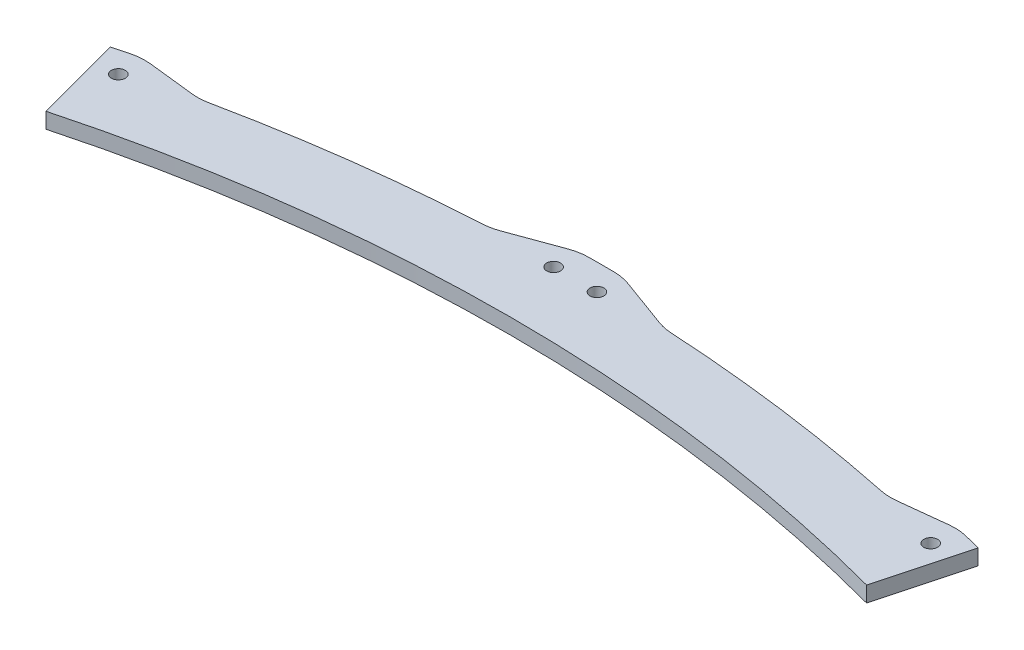
ISO-10303-21;
HEADER;
FILE_DESCRIPTION(('STEP AP214'),'2;1');
FILE_NAME('part.step','',(''),(''),'','','');
FILE_SCHEMA(('AUTOMOTIVE_DESIGN { 1 0 10303 214 1 1 1 1 }'));
ENDSEC;
DATA;
#1=APPLICATION_CONTEXT('core data for automotive mechanical design processes');
#2=APPLICATION_PROTOCOL_DEFINITION('international standard','automotive_design',2000,#1);
#3=PRODUCT_CONTEXT('',#1,'mechanical');
#4=PRODUCT('Part','Part','',(#3));
#5=PRODUCT_RELATED_PRODUCT_CATEGORY('part','',(#4));
#6=PRODUCT_DEFINITION_FORMATION('','',#4);
#7=PRODUCT_DEFINITION_CONTEXT('part definition',#1,'design');
#8=PRODUCT_DEFINITION('design','',#6,#7);
#9=PRODUCT_DEFINITION_SHAPE('','',#8);
#10=(LENGTH_UNIT() NAMED_UNIT(*) SI_UNIT(.MILLI.,.METRE.));
#11=(NAMED_UNIT(*) PLANE_ANGLE_UNIT() SI_UNIT($,.RADIAN.));
#12=(NAMED_UNIT(*) SI_UNIT($,.STERADIAN.) SOLID_ANGLE_UNIT());
#13=UNCERTAINTY_MEASURE_WITH_UNIT(LENGTH_MEASURE(1.E-05),#10,'distance_accuracy_value','');
#14=(GEOMETRIC_REPRESENTATION_CONTEXT(3) GLOBAL_UNCERTAINTY_ASSIGNED_CONTEXT((#13)) GLOBAL_UNIT_ASSIGNED_CONTEXT((#10,
#11,#12)) REPRESENTATION_CONTEXT('',''));
#15=CARTESIAN_POINT('',(0.,0.,0.));
#16=DIRECTION('',(0.,0.,1.));
#17=DIRECTION('',(1.,0.,0.));
#18=AXIS2_PLACEMENT_3D('',#15,#16,#17);
#19=CARTESIAN_POINT('',(0.,9.00000000000001,0.));
#20=DIRECTION('',(-0.96592582628907,0.,-0.258819045102515));
#21=DIRECTION('',(-0.258819045102515,0.,0.96592582628907));
#22=AXIS2_PLACEMENT_3D('',#19,#20,#21);
#23=PLANE('',#22);
#24=DIRECTION('',(0.258819045102515,0.,-0.96592582628907));
#25=VECTOR('',#24,1.);
#26=CARTESIAN_POINT('',(0.,0.,0.));
#27=LINE('',#26,#25);
#28=CARTESIAN_POINT('',(236.819426268801,0.,-883.822131054499));
#29=VERTEX_POINT('',#28);
#30=CARTESIAN_POINT('',(250.407426136683,0.,-934.533236934675));
#31=VERTEX_POINT('',#30);
#32=EDGE_CURVE('E211',#29,#31,#27,.T.);
#33=ORIENTED_EDGE('',*,*,#32,.T.);
#34=DIRECTION('',(0.,-1.,0.));
#35=VECTOR('',#34,1.);
#36=CARTESIAN_POINT('',(250.407426136683,9.00000000000001,-934.533236934675));
#37=LINE('',#36,#35);
#38=CARTESIAN_POINT('',(250.407426136683,9.00000000000001,-934.533236934675));
#39=VERTEX_POINT('',#38);
#40=EDGE_CURVE('E191',#39,#31,#37,.T.);
#41=ORIENTED_EDGE('',*,*,#40,.F.);
#42=DIRECTION('',(0.258819045102515,0.,-0.96592582628907));
#43=VECTOR('',#42,1.);
#44=CARTESIAN_POINT('',(0.,9.00000000000001,0.));
#45=LINE('',#44,#43);
#46=CARTESIAN_POINT('',(236.819426268801,9.00000000000001,-883.822131054499));
#47=VERTEX_POINT('',#46);
#48=EDGE_CURVE('E198',#47,#39,#45,.T.);
#49=ORIENTED_EDGE('',*,*,#48,.F.);
#50=DIRECTION('',(0.,-1.,0.));
#51=VECTOR('',#50,1.);
#52=CARTESIAN_POINT('',(236.819426268801,9.00000000000001,-883.822131054499));
#53=LINE('',#52,#51);
#54=EDGE_CURVE('E363',#47,#29,#53,.T.);
#55=ORIENTED_EDGE('',*,*,#54,.T.);
#56=EDGE_LOOP('',(#33,#41,#49,#55));
#57=FACE_BOUND('',#56,.T.);
#58=ADVANCED_FACE('F48',(#57),#23,.F.);
#59=CARTESIAN_POINT('',(0.,9.00000000000001,0.));
#60=DIRECTION('',(0.,-1.,0.));
#61=DIRECTION('',(0.,0.,-1.));
#62=AXIS2_PLACEMENT_3D('',#59,#60,#61);
#63=CYLINDRICAL_SURFACE('',#62,967.5);
#64=CARTESIAN_POINT('',(0.,0.,0.));
#65=DIRECTION('',(0.,1.,0.));
#66=DIRECTION('',(0.,0.,1.));
#67=AXIS2_PLACEMENT_3D('',#64,#65,#66);
#68=CIRCLE('',#67,967.5);
#69=CARTESIAN_POINT('',(241.267136964022,0.,-936.934586095093));
#70=VERTEX_POINT('',#69);
#71=EDGE_CURVE('E382',#31,#70,#68,.T.);
#72=ORIENTED_EDGE('',*,*,#71,.T.);
#73=DIRECTION('',(0.,-1.,0.));
#74=VECTOR('',#73,1.);
#75=CARTESIAN_POINT('',(241.267136964022,9.00000000000001,-936.934586095093));
#76=LINE('',#75,#74);
#77=CARTESIAN_POINT('',(241.267136964022,9.00000000000001,-936.934586095093));
#78=VERTEX_POINT('',#77);
#79=EDGE_CURVE('E194',#70,#78,#76,.F.);
#80=ORIENTED_EDGE('',*,*,#79,.T.);
#81=CARTESIAN_POINT('',(0.,9.00000000000001,0.));
#82=DIRECTION('',(0.,1.,0.));
#83=DIRECTION('',(0.,0.,1.));
#84=AXIS2_PLACEMENT_3D('',#81,#82,#83);
#85=CIRCLE('',#84,967.5);
#86=EDGE_CURVE('E186',#39,#78,#85,.T.);
#87=ORIENTED_EDGE('',*,*,#86,.F.);
#88=ORIENTED_EDGE('',*,*,#40,.T.);
#89=EDGE_LOOP('',(#72,#80,#87,#88));
#90=FACE_BOUND('',#89,.T.);
#91=ADVANCED_FACE('F189',(#90),#63,.T.);
#92=CARTESIAN_POINT('',(-100.520614540542,9.00000000000001,-900.76158334821));
#93=DIRECTION('',(0.110906689405892,0.,0.99383082375474));
#94=DIRECTION('',(0.99383082375474,0.,-0.110906689405892));
#95=AXIS2_PLACEMENT_3D('',#92,#93,#94);
#96=PLANE('',#95);
#97=DIRECTION('',(-0.99383082375474,0.,0.110906689405892));
#98=VECTOR('',#97,1.);
#99=CARTESIAN_POINT('',(-100.520614540542,9.00000000000001,-900.76158334821));
#100=LINE('',#99,#98);
#101=CARTESIAN_POINT('',(230.458784748077,9.00000000000001,-937.69727557998));
#102=VERTEX_POINT('',#101);
#103=CARTESIAN_POINT('',(203.318668859168,9.00000000000001,-934.668570561596));
#104=VERTEX_POINT('',#103);
#105=EDGE_CURVE('E197',#102,#104,#100,.T.);
#106=ORIENTED_EDGE('',*,*,#105,.F.);
#107=DIRECTION('',(0.,-1.,0.));
#108=VECTOR('',#107,1.);
#109=CARTESIAN_POINT('',(230.458784748077,9.00000000000001,-937.69727557998));
#110=LINE('',#109,#108);
#111=CARTESIAN_POINT('',(230.458784748077,0.,-937.69727557998));
#112=VERTEX_POINT('',#111);
#113=EDGE_CURVE('E219',#102,#112,#110,.T.);
#114=ORIENTED_EDGE('',*,*,#113,.T.);
#115=DIRECTION('',(-0.99383082375474,0.,0.110906689405892));
#116=VECTOR('',#115,1.);
#117=CARTESIAN_POINT('',(-100.520614540542,0.,-900.76158334821));
#118=LINE('',#117,#116);
#119=CARTESIAN_POINT('',(203.318668859168,0.,-934.668570561596));
#120=VERTEX_POINT('',#119);
#121=EDGE_CURVE('E385',#112,#120,#118,.T.);
#122=ORIENTED_EDGE('',*,*,#121,.T.);
#123=DIRECTION('',(0.,1.,0.));
#124=VECTOR('',#123,1.);
#125=CARTESIAN_POINT('',(203.318668859168,9.00000000000001,-934.668570561596));
#126=LINE('',#125,#124);
#127=EDGE_CURVE('E213',#120,#104,#126,.T.);
#128=ORIENTED_EDGE('',*,*,#127,.T.);
#129=EDGE_LOOP('',(#106,#114,#122,#128));
#130=FACE_BOUND('',#129,.T.);
#131=ADVANCED_FACE('F434',(#130),#96,.F.);
#132=CARTESIAN_POINT('',(0.,9.00000000000001,0.));
#133=DIRECTION('',(0.,-1.,0.));
#134=DIRECTION('',(0.,0.,-1.));
#135=AXIS2_PLACEMENT_3D('',#132,#133,#134);
#136=CYLINDRICAL_SURFACE('',#135,955.);
#137=CARTESIAN_POINT('',(0.,9.00000000000001,0.));
#138=DIRECTION('',(0.,1.,0.));
#139=DIRECTION('',(0.,0.,1.));
#140=AXIS2_PLACEMENT_3D('',#137,#138,#139);
#141=CIRCLE('',#140,955.);
#142=CARTESIAN_POINT('',(193.900357471093,9.00000000000001,-935.108363438474));
#143=VERTEX_POINT('',#142);
#144=CARTESIAN_POINT('',(54.4011990905174,9.00000000000001,-953.449269514385));
#145=VERTEX_POINT('',#144);
#146=EDGE_CURVE('E354',#143,#145,#141,.T.);
#147=ORIENTED_EDGE('',*,*,#146,.F.);
#148=DIRECTION('',(0.,-1.,0.));
#149=VECTOR('',#148,1.);
#150=CARTESIAN_POINT('',(193.900357471093,9.00000000000001,-935.108363438475));
#151=LINE('',#150,#149);
#152=CARTESIAN_POINT('',(193.900357471093,0.,-935.108363438474));
#153=VERTEX_POINT('',#152);
#154=EDGE_CURVE('E256',#143,#153,#151,.T.);
#155=ORIENTED_EDGE('',*,*,#154,.T.);
#156=CARTESIAN_POINT('',(0.,0.,0.));
#157=DIRECTION('',(0.,1.,0.));
#158=DIRECTION('',(0.,0.,1.));
#159=AXIS2_PLACEMENT_3D('',#156,#157,#158);
#160=CIRCLE('',#159,955.);
#161=CARTESIAN_POINT('',(54.4011990905174,0.,-953.449269514385));
#162=VERTEX_POINT('',#161);
#163=EDGE_CURVE('E337',#153,#162,#160,.T.);
#164=ORIENTED_EDGE('',*,*,#163,.T.);
#165=DIRECTION('',(0.,-1.,0.));
#166=VECTOR('',#165,1.);
#167=CARTESIAN_POINT('',(54.4011990905174,9.00000000000001,-953.449269514385));
#168=LINE('',#167,#166);
#169=EDGE_CURVE('E253',#162,#145,#168,.F.);
#170=ORIENTED_EDGE('',*,*,#169,.T.);
#171=EDGE_LOOP('',(#147,#155,#164,#170));
#172=FACE_BOUND('',#171,.T.);
#173=ADVANCED_FACE('F486',(#172),#136,.T.);
#174=CARTESIAN_POINT('',(313.79566180747,9.00000000000001,-857.112527219899));
#175=DIRECTION('',(0.343792078237133,0.,-0.939045795976635));
#176=DIRECTION('',(-0.939045795976636,0.,-0.343792078237133));
#177=AXIS2_PLACEMENT_3D('',#174,#175,#176);
#178=PLANE('',#177);
#179=DIRECTION('',(0.939045795976636,0.,0.343792078237133));
#180=VECTOR('',#179,1.);
#181=CARTESIAN_POINT('',(313.79566180747,9.00000000000001,-857.112527219899));
#182=LINE('',#181,#180);
#183=CARTESIAN_POINT('',(17.3462496087965,9.00000000000001,-965.64499704046));
#184=VERTEX_POINT('',#183);
#185=CARTESIAN_POINT('',(45.7963749347286,9.00000000000001,-955.229181588417));
#186=VERTEX_POINT('',#185);
#187=EDGE_CURVE('E441',#184,#186,#182,.T.);
#188=ORIENTED_EDGE('',*,*,#187,.T.);
#189=DIRECTION('',(0.,-1.,0.));
#190=VECTOR('',#189,1.);
#191=CARTESIAN_POINT('',(45.7963749347286,9.00000000000001,-955.229181588417));
#192=LINE('',#191,#190);
#193=CARTESIAN_POINT('',(45.7963749347286,0.,-955.229181588417));
#194=VERTEX_POINT('',#193);
#195=EDGE_CURVE('E263',#186,#194,#192,.T.);
#196=ORIENTED_EDGE('',*,*,#195,.T.);
#197=DIRECTION('',(0.939045795976636,0.,0.343792078237133));
#198=VECTOR('',#197,1.);
#199=CARTESIAN_POINT('',(313.79566180747,0.,-857.112527219899));
#200=LINE('',#199,#198);
#201=CARTESIAN_POINT('',(17.3462496087965,0.,-965.64499704046));
#202=VERTEX_POINT('',#201);
#203=EDGE_CURVE('E391',#202,#194,#200,.T.);
#204=ORIENTED_EDGE('',*,*,#203,.F.);
#205=DIRECTION('',(0.,-1.,0.));
#206=VECTOR('',#205,1.);
#207=CARTESIAN_POINT('',(17.3462496087965,9.00000000000001,-965.64499704046));
#208=LINE('',#207,#206);
#209=EDGE_CURVE('E260',#202,#184,#208,.F.);
#210=ORIENTED_EDGE('',*,*,#209,.T.);
#211=EDGE_LOOP('',(#188,#196,#204,#210));
#212=FACE_BOUND('',#211,.T.);
#213=ADVANCED_FACE('F476',(#212),#178,.T.);
#214=CARTESIAN_POINT('',(0.,9.00000000000001,0.));
#215=DIRECTION('',(0.,-1.,0.));
#216=DIRECTION('',(0.,0.,-1.));
#217=AXIS2_PLACEMENT_3D('',#214,#215,#216);
#218=CYLINDRICAL_SURFACE('',#217,967.5);
#219=CARTESIAN_POINT('',(0.,9.00000000000001,0.));
#220=DIRECTION('',(0.,1.,0.));
#221=DIRECTION('',(0.,0.,1.));
#222=AXIS2_PLACEMENT_3D('',#219,#220,#221);
#223=CIRCLE('',#222,967.5);
#224=CARTESIAN_POINT('',(-7.25752685405631,9.00000000000001,-967.472779102318));
#225=VERTEX_POINT('',#224);
#226=CARTESIAN_POINT('',(7.25752685405631,9.00000000000001,-967.472779102318));
#227=VERTEX_POINT('',#226);
#228=EDGE_CURVE('E445',#225,#227,#223,.F.);
#229=ORIENTED_EDGE('',*,*,#228,.T.);
#230=DIRECTION('',(0.,-1.,0.));
#231=VECTOR('',#230,1.);
#232=CARTESIAN_POINT('',(7.25752685405634,9.00000000000001,-967.472779102318));
#233=LINE('',#232,#231);
#234=CARTESIAN_POINT('',(7.25752685405631,0.,-967.472779102318));
#235=VERTEX_POINT('',#234);
#236=EDGE_CURVE('E270',#227,#235,#233,.T.);
#237=ORIENTED_EDGE('',*,*,#236,.T.);
#238=CARTESIAN_POINT('',(0.,0.,0.));
#239=DIRECTION('',(0.,1.,0.));
#240=DIRECTION('',(0.,0.,1.));
#241=AXIS2_PLACEMENT_3D('',#238,#239,#240);
#242=CIRCLE('',#241,967.5);
#243=CARTESIAN_POINT('',(-7.25752685405631,0.,-967.472779102318));
#244=VERTEX_POINT('',#243);
#245=EDGE_CURVE('E395',#244,#235,#242,.F.);
#246=ORIENTED_EDGE('',*,*,#245,.F.);
#247=DIRECTION('',(0.,-1.,0.));
#248=VECTOR('',#247,1.);
#249=CARTESIAN_POINT('',(-7.25752685405634,9.00000000000001,-967.472779102318));
#250=LINE('',#249,#248);
#251=EDGE_CURVE('E267',#244,#225,#250,.F.);
#252=ORIENTED_EDGE('',*,*,#251,.T.);
#253=EDGE_LOOP('',(#229,#237,#246,#252));
#254=FACE_BOUND('',#253,.T.);
#255=ADVANCED_FACE('F469',(#254),#218,.T.);
#256=CARTESIAN_POINT('',(-313.79566180747,9.00000000000001,-857.112527219899));
#257=DIRECTION('',(0.343792078237133,0.,0.939045795976635));
#258=DIRECTION('',(0.939045795976636,0.,-0.343792078237133));
#259=AXIS2_PLACEMENT_3D('',#256,#257,#258);
#260=PLANE('',#259);
#261=DIRECTION('',(-0.939045795976636,0.,0.343792078237133));
#262=VECTOR('',#261,1.);
#263=CARTESIAN_POINT('',(-313.79566180747,9.00000000000001,-857.112527219899));
#264=LINE('',#263,#262);
#265=CARTESIAN_POINT('',(-17.3462496087965,9.00000000000001,-965.64499704046));
#266=VERTEX_POINT('',#265);
#267=CARTESIAN_POINT('',(-45.7963749347286,9.00000000000001,-955.229181588417));
#268=VERTEX_POINT('',#267);
#269=EDGE_CURVE('E352',#266,#268,#264,.T.);
#270=ORIENTED_EDGE('',*,*,#269,.F.);
#271=DIRECTION('',(0.,1.,0.));
#272=VECTOR('',#271,1.);
#273=CARTESIAN_POINT('',(-17.3462496087965,0.,-965.64499704046));
#274=LINE('',#273,#272);
#275=CARTESIAN_POINT('',(-17.3462496087965,0.,-965.64499704046));
#276=VERTEX_POINT('',#275);
#277=EDGE_CURVE('E277',#266,#276,#274,.F.);
#278=ORIENTED_EDGE('',*,*,#277,.T.);
#279=DIRECTION('',(-0.939045795976636,0.,0.343792078237133));
#280=VECTOR('',#279,1.);
#281=CARTESIAN_POINT('',(-313.79566180747,0.,-857.112527219899));
#282=LINE('',#281,#280);
#283=CARTESIAN_POINT('',(-45.7963749347286,0.,-955.229181588417));
#284=VERTEX_POINT('',#283);
#285=EDGE_CURVE('E335',#276,#284,#282,.T.);
#286=ORIENTED_EDGE('',*,*,#285,.T.);
#287=DIRECTION('',(0.,1.,0.));
#288=VECTOR('',#287,1.);
#289=CARTESIAN_POINT('',(-45.7963749347286,9.00000000000001,-955.229181588417));
#290=LINE('',#289,#288);
#291=EDGE_CURVE('E274',#284,#268,#290,.T.);
#292=ORIENTED_EDGE('',*,*,#291,.T.);
#293=EDGE_LOOP('',(#270,#278,#286,#292));
#294=FACE_BOUND('',#293,.T.);
#295=ADVANCED_FACE('F464',(#294),#260,.F.);
#296=CARTESIAN_POINT('',(-54.4011990905174,9.00000000000001,-953.449269514385));
#297=VERTEX_POINT('',#296);
#298=CARTESIAN_POINT('',(-193.900357471093,9.00000000000001,-935.108363438474));
#299=VERTEX_POINT('',#298);
#300=EDGE_CURVE('E345',#297,#299,#141,.T.);
#301=ORIENTED_EDGE('',*,*,#300,.F.);
#302=DIRECTION('',(0.,-1.,0.));
#303=VECTOR('',#302,1.);
#304=CARTESIAN_POINT('',(-54.4011990905174,9.00000000000001,-953.449269514385));
#305=LINE('',#304,#303);
#306=CARTESIAN_POINT('',(-54.4011990905174,0.,-953.449269514385));
#307=VERTEX_POINT('',#306);
#308=EDGE_CURVE('E284',#297,#307,#305,.T.);
#309=ORIENTED_EDGE('',*,*,#308,.T.);
#310=CARTESIAN_POINT('',(-193.900357471093,0.,-935.108363438474));
#311=VERTEX_POINT('',#310);
#312=EDGE_CURVE('E324',#307,#311,#160,.T.);
#313=ORIENTED_EDGE('',*,*,#312,.T.);
#314=DIRECTION('',(0.,-1.,0.));
#315=VECTOR('',#314,1.);
#316=CARTESIAN_POINT('',(-193.900357471093,9.00000000000001,-935.108363438475));
#317=LINE('',#316,#315);
#318=EDGE_CURVE('E281',#311,#299,#317,.F.);
#319=ORIENTED_EDGE('',*,*,#318,.T.);
#320=EDGE_LOOP('',(#301,#309,#313,#319));
#321=FACE_BOUND('',#320,.T.);
#322=ADVANCED_FACE('F332',(#321),#136,.T.);
#323=CARTESIAN_POINT('',(100.520614540542,9.00000000000001,-900.76158334821));
#324=DIRECTION('',(0.110906689405892,0.,-0.99383082375474));
#325=DIRECTION('',(-0.99383082375474,0.,-0.110906689405892));
#326=AXIS2_PLACEMENT_3D('',#323,#324,#325);
#327=PLANE('',#326);
#328=DIRECTION('',(0.99383082375474,0.,0.110906689405892));
#329=VECTOR('',#328,1.);
#330=CARTESIAN_POINT('',(100.520614540542,9.00000000000001,-900.76158334821));
#331=LINE('',#330,#329);
#332=CARTESIAN_POINT('',(-230.458784748077,9.00000000000001,-937.69727557998));
#333=VERTEX_POINT('',#332);
#334=CARTESIAN_POINT('',(-203.318668859168,9.00000000000001,-934.668570561596));
#335=VERTEX_POINT('',#334);
#336=EDGE_CURVE('E342',#333,#335,#331,.T.);
#337=ORIENTED_EDGE('',*,*,#336,.T.);
#338=DIRECTION('',(0.,-1.,0.));
#339=VECTOR('',#338,1.);
#340=CARTESIAN_POINT('',(-203.318668859168,9.00000000000001,-934.668570561596));
#341=LINE('',#340,#339);
#342=CARTESIAN_POINT('',(-203.318668859168,0.,-934.668570561596));
#343=VERTEX_POINT('',#342);
#344=EDGE_CURVE('E291',#335,#343,#341,.T.);
#345=ORIENTED_EDGE('',*,*,#344,.T.);
#346=DIRECTION('',(0.99383082375474,0.,0.110906689405892));
#347=VECTOR('',#346,1.);
#348=CARTESIAN_POINT('',(100.520614540542,0.,-900.76158334821));
#349=LINE('',#348,#347);
#350=CARTESIAN_POINT('',(-230.458784748077,0.,-937.69727557998));
#351=VERTEX_POINT('',#350);
#352=EDGE_CURVE('E326',#351,#343,#349,.T.);
#353=ORIENTED_EDGE('',*,*,#352,.F.);
#354=DIRECTION('',(0.,-1.,0.));
#355=VECTOR('',#354,1.);
#356=CARTESIAN_POINT('',(-230.458784748077,9.00000000000001,-937.69727557998));
#357=LINE('',#356,#355);
#358=EDGE_CURVE('E288',#351,#333,#357,.F.);
#359=ORIENTED_EDGE('',*,*,#358,.T.);
#360=EDGE_LOOP('',(#337,#345,#353,#359));
#361=FACE_BOUND('',#360,.T.);
#362=ADVANCED_FACE('F340',(#361),#327,.T.);
#363=CARTESIAN_POINT('',(0.,9.00000000000001,0.));
#364=DIRECTION('',(0.,-1.,0.));
#365=DIRECTION('',(0.,0.,-1.));
#366=AXIS2_PLACEMENT_3D('',#363,#364,#365);
#367=CYLINDRICAL_SURFACE('',#366,967.5);
#368=CARTESIAN_POINT('',(0.,9.00000000000001,0.));
#369=DIRECTION('',(0.,1.,0.));
#370=DIRECTION('',(0.,0.,1.));
#371=AXIS2_PLACEMENT_3D('',#368,#369,#370);
#372=CIRCLE('',#371,967.5);
#373=CARTESIAN_POINT('',(-250.407426136683,9.00000000000001,-934.533236934675));
#374=VERTEX_POINT('',#373);
#375=CARTESIAN_POINT('',(-241.267136964022,9.00000000000001,-936.934586095093));
#376=VERTEX_POINT('',#375);
#377=EDGE_CURVE('E344',#374,#376,#372,.F.);
#378=ORIENTED_EDGE('',*,*,#377,.T.);
#379=DIRECTION('',(0.,-1.,0.));
#380=VECTOR('',#379,1.);
#381=CARTESIAN_POINT('',(-241.267136964022,9.00000000000001,-936.934586095093));
#382=LINE('',#381,#380);
#383=CARTESIAN_POINT('',(-241.267136964022,0.,-936.934586095093));
#384=VERTEX_POINT('',#383);
#385=EDGE_CURVE('E295',#376,#384,#382,.T.);
#386=ORIENTED_EDGE('',*,*,#385,.T.);
#387=CARTESIAN_POINT('',(0.,0.,0.));
#388=DIRECTION('',(0.,1.,0.));
#389=DIRECTION('',(0.,0.,1.));
#390=AXIS2_PLACEMENT_3D('',#387,#388,#389);
#391=CIRCLE('',#390,967.5);
#392=CARTESIAN_POINT('',(-250.407426136683,0.,-934.533236934675));
#393=VERTEX_POINT('',#392);
#394=EDGE_CURVE('E404',#393,#384,#391,.F.);
#395=ORIENTED_EDGE('',*,*,#394,.F.);
#396=DIRECTION('',(0.,-1.,0.));
#397=VECTOR('',#396,1.);
#398=CARTESIAN_POINT('',(-250.407426136683,9.00000000000001,-934.533236934675));
#399=LINE('',#398,#397);
#400=EDGE_CURVE('E214',#374,#393,#399,.T.);
#401=ORIENTED_EDGE('',*,*,#400,.F.);
#402=EDGE_LOOP('',(#378,#386,#395,#401));
#403=FACE_BOUND('',#402,.T.);
#404=ADVANCED_FACE('F549',(#403),#367,.T.);
#405=CARTESIAN_POINT('',(0.,9.00000000000001,0.));
#406=DIRECTION('',(-0.96592582628907,0.,0.258819045102515));
#407=DIRECTION('',(0.258819045102515,0.,0.96592582628907));
#408=AXIS2_PLACEMENT_3D('',#405,#406,#407);
#409=PLANE('',#408);
#410=DIRECTION('',(-0.258819045102515,0.,-0.96592582628907));
#411=VECTOR('',#410,1.);
#412=CARTESIAN_POINT('',(0.,0.,0.));
#413=LINE('',#412,#411);
#414=CARTESIAN_POINT('',(-236.819426268801,0.,-883.822131054499));
#415=VERTEX_POINT('',#414);
#416=EDGE_CURVE('E408',#415,#393,#413,.T.);
#417=ORIENTED_EDGE('',*,*,#416,.F.);
#418=DIRECTION('',(0.,-1.,0.));
#419=VECTOR('',#418,1.);
#420=CARTESIAN_POINT('',(-236.819426268801,9.00000000000001,-883.822131054499));
#421=LINE('',#420,#419);
#422=CARTESIAN_POINT('',(-236.819426268801,9.00000000000001,-883.822131054499));
#423=VERTEX_POINT('',#422);
#424=EDGE_CURVE('E221',#423,#415,#421,.T.);
#425=ORIENTED_EDGE('',*,*,#424,.F.);
#426=DIRECTION('',(-0.258819045102515,0.,-0.96592582628907));
#427=VECTOR('',#426,1.);
#428=CARTESIAN_POINT('',(0.,9.00000000000001,0.));
#429=LINE('',#428,#427);
#430=EDGE_CURVE('E350',#423,#374,#429,.T.);
#431=ORIENTED_EDGE('',*,*,#430,.T.);
#432=ORIENTED_EDGE('',*,*,#400,.T.);
#433=EDGE_LOOP('',(#417,#425,#431,#432));
#434=FACE_BOUND('',#433,.T.);
#435=ADVANCED_FACE('F425',(#434),#409,.T.);
#436=CARTESIAN_POINT('',(-234.429838121223,9.00000000000001,-923.200357993029));
#437=DIRECTION('',(0.,-1.,0.));
#438=DIRECTION('',(0.,0.,-1.));
#439=AXIS2_PLACEMENT_3D('',#436,#437,#438);
#440=CYLINDRICAL_SURFACE('',#439,3.99999999999999);
#441=CARTESIAN_POINT('',(-234.429838121223,9.00000000000001,-923.200357993029));
#442=DIRECTION('',(0.,1.,0.));
#443=DIRECTION('',(0.,0.,1.));
#444=AXIS2_PLACEMENT_3D('',#441,#442,#443);
#445=CIRCLE('',#444,3.99999999999999);
#446=CARTESIAN_POINT('',(-234.429838121223,9.00000000000001,-919.200357993029));
#447=VERTEX_POINT('',#446);
#448=EDGE_CURVE('E208',#447,#447,#445,.T.);
#449=ORIENTED_EDGE('',*,*,#448,.T.);
#450=EDGE_LOOP('',(#449));
#451=FACE_BOUND('',#450,.T.);
#452=CARTESIAN_POINT('',(-234.429838121223,0.,-923.200357993029));
#453=DIRECTION('',(0.,1.,0.));
#454=DIRECTION('',(0.,0.,1.));
#455=AXIS2_PLACEMENT_3D('',#452,#453,#454);
#456=CIRCLE('',#455,3.99999999999999);
#457=CARTESIAN_POINT('',(-234.429838121223,0.,-919.200357993029));
#458=VERTEX_POINT('',#457);
#459=EDGE_CURVE('E376',#458,#458,#456,.T.);
#460=ORIENTED_EDGE('',*,*,#459,.F.);
#461=EDGE_LOOP('',(#460));
#462=FACE_BOUND('',#461,.T.);
#463=ADVANCED_FACE('F506',(#451,#462),#440,.F.);
#464=CARTESIAN_POINT('',(-12.5,9.00000000000001,-952.5));
#465=DIRECTION('',(0.,-1.,0.));
#466=DIRECTION('',(0.,0.,-1.));
#467=AXIS2_PLACEMENT_3D('',#464,#465,#466);
#468=CYLINDRICAL_SURFACE('',#467,4.);
#469=CARTESIAN_POINT('',(-12.5,9.00000000000001,-952.5));
#470=DIRECTION('',(0.,1.,0.));
#471=DIRECTION('',(0.,0.,1.));
#472=AXIS2_PLACEMENT_3D('',#469,#470,#471);
#473=CIRCLE('',#472,4.);
#474=CARTESIAN_POINT('',(-12.5,9.00000000000001,-948.5));
#475=VERTEX_POINT('',#474);
#476=EDGE_CURVE('E800',#475,#475,#473,.T.);
#477=ORIENTED_EDGE('',*,*,#476,.T.);
#478=EDGE_LOOP('',(#477));
#479=FACE_BOUND('',#478,.T.);
#480=CARTESIAN_POINT('',(-12.5,0.,-952.5));
#481=DIRECTION('',(0.,1.,0.));
#482=DIRECTION('',(0.,0.,1.));
#483=AXIS2_PLACEMENT_3D('',#480,#481,#482);
#484=CIRCLE('',#483,4.);
#485=CARTESIAN_POINT('',(-12.5,0.,-948.5));
#486=VERTEX_POINT('',#485);
#487=EDGE_CURVE('E372',#486,#486,#484,.T.);
#488=ORIENTED_EDGE('',*,*,#487,.F.);
#489=EDGE_LOOP('',(#488));
#490=FACE_BOUND('',#489,.T.);
#491=ADVANCED_FACE('F509',(#479,#490),#468,.F.);
#492=CARTESIAN_POINT('',(12.5,9.00000000000001,-952.5));
#493=DIRECTION('',(0.,-1.,0.));
#494=DIRECTION('',(0.,0.,-1.));
#495=AXIS2_PLACEMENT_3D('',#492,#493,#494);
#496=CYLINDRICAL_SURFACE('',#495,4.);
#497=CARTESIAN_POINT('',(12.5,9.00000000000001,-952.5));
#498=DIRECTION('',(0.,1.,0.));
#499=DIRECTION('',(0.,0.,1.));
#500=AXIS2_PLACEMENT_3D('',#497,#498,#499);
#501=CIRCLE('',#500,4.);
#502=CARTESIAN_POINT('',(12.5,9.00000000000001,-948.5));
#503=VERTEX_POINT('',#502);
#504=EDGE_CURVE('E796',#503,#503,#501,.F.);
#505=ORIENTED_EDGE('',*,*,#504,.F.);
#506=EDGE_LOOP('',(#505));
#507=FACE_BOUND('',#506,.T.);
#508=CARTESIAN_POINT('',(12.5,0.,-952.5));
#509=DIRECTION('',(0.,1.,0.));
#510=DIRECTION('',(0.,0.,1.));
#511=AXIS2_PLACEMENT_3D('',#508,#509,#510);
#512=CIRCLE('',#511,4.);
#513=CARTESIAN_POINT('',(12.5,0.,-948.5));
#514=VERTEX_POINT('',#513);
#515=EDGE_CURVE('E368',#514,#514,#512,.F.);
#516=ORIENTED_EDGE('',*,*,#515,.T.);
#517=EDGE_LOOP('',(#516));
#518=FACE_BOUND('',#517,.T.);
#519=ADVANCED_FACE('F513',(#507,#518),#496,.F.);
#520=CARTESIAN_POINT('',(234.429838121223,9.00000000000001,-923.200357993029));
#521=DIRECTION('',(0.,-1.,0.));
#522=DIRECTION('',(0.,0.,-1.));
#523=AXIS2_PLACEMENT_3D('',#520,#521,#522);
#524=CYLINDRICAL_SURFACE('',#523,3.99999999999999);
#525=CARTESIAN_POINT('',(234.429838121223,9.00000000000001,-923.200357993029));
#526=DIRECTION('',(0.,1.,0.));
#527=DIRECTION('',(0.,0.,1.));
#528=AXIS2_PLACEMENT_3D('',#525,#526,#527);
#529=CIRCLE('',#528,3.99999999999999);
#530=CARTESIAN_POINT('',(234.429838121223,9.00000000000001,-919.200357993029));
#531=VERTEX_POINT('',#530);
#532=EDGE_CURVE('E416',#531,#531,#529,.F.);
#533=ORIENTED_EDGE('',*,*,#532,.F.);
#534=EDGE_LOOP('',(#533));
#535=FACE_BOUND('',#534,.T.);
#536=CARTESIAN_POINT('',(234.429838121223,0.,-923.200357993029));
#537=DIRECTION('',(0.,1.,0.));
#538=DIRECTION('',(0.,0.,1.));
#539=AXIS2_PLACEMENT_3D('',#536,#537,#538);
#540=CIRCLE('',#539,3.99999999999999);
#541=CARTESIAN_POINT('',(234.429838121223,0.,-919.200357993029));
#542=VERTEX_POINT('',#541);
#543=EDGE_CURVE('E364',#542,#542,#540,.F.);
#544=ORIENTED_EDGE('',*,*,#543,.T.);
#545=EDGE_LOOP('',(#544));
#546=FACE_BOUND('',#545,.T.);
#547=ADVANCED_FACE('F517',(#535,#546),#524,.F.);
#548=CARTESIAN_POINT('',(0.,9.00000000000001,0.));
#549=DIRECTION('',(0.,-1.,0.));
#550=DIRECTION('',(0.,0.,-1.));
#551=AXIS2_PLACEMENT_3D('',#548,#549,#550);
#552=CYLINDRICAL_SURFACE('',#551,915.);
#553=CARTESIAN_POINT('',(0.,0.,0.));
#554=DIRECTION('',(0.,1.,0.));
#555=DIRECTION('',(0.,0.,1.));
#556=AXIS2_PLACEMENT_3D('',#553,#554,#555);
#557=CIRCLE('',#556,915.);
#558=EDGE_CURVE('E412',#29,#415,#557,.T.);
#559=ORIENTED_EDGE('',*,*,#558,.F.);
#560=ORIENTED_EDGE('',*,*,#54,.F.);
#561=CARTESIAN_POINT('',(0.,9.00000000000001,0.));
#562=DIRECTION('',(0.,1.,0.));
#563=DIRECTION('',(0.,0.,1.));
#564=AXIS2_PLACEMENT_3D('',#561,#562,#563);
#565=CIRCLE('',#564,915.);
#566=EDGE_CURVE('E205',#47,#423,#565,.T.);
#567=ORIENTED_EDGE('',*,*,#566,.T.);
#568=ORIENTED_EDGE('',*,*,#424,.T.);
#569=EDGE_LOOP('',(#559,#560,#567,#568));
#570=FACE_BOUND('',#569,.T.);
#571=ADVANCED_FACE('F423',(#570),#552,.F.);
#572=CARTESIAN_POINT('',(0.,9.00000000000001,0.));
#573=DIRECTION('',(0.,1.,0.));
#574=DIRECTION('',(0.,0.,1.));
#575=AXIS2_PLACEMENT_3D('',#572,#573,#574);
#576=PLANE('',#575);
#577=ORIENTED_EDGE('',*,*,#532,.T.);
#578=EDGE_LOOP('',(#577));
#579=FACE_BOUND('',#578,.T.);
#580=ORIENTED_EDGE('',*,*,#504,.T.);
#581=EDGE_LOOP('',(#580));
#582=FACE_BOUND('',#581,.T.);
#583=ORIENTED_EDGE('',*,*,#476,.F.);
#584=EDGE_LOOP('',(#583));
#585=FACE_BOUND('',#584,.T.);
#586=ORIENTED_EDGE('',*,*,#448,.F.);
#587=EDGE_LOOP('',(#586));
#588=FACE_BOUND('',#587,.T.);
#589=ORIENTED_EDGE('',*,*,#86,.T.);
#590=CARTESIAN_POINT('',(233.785985430254,9.00000000000001,-907.882350867338));
#591=DIRECTION('',(0.,1.,0.));
#592=DIRECTION('',(0.,0.,1.));
#593=AXIS2_PLACEMENT_3D('',#590,#591,#592);
#594=CIRCLE('',#593,30.);
#595=EDGE_CURVE('E250',#78,#102,#594,.T.);
#596=ORIENTED_EDGE('',*,*,#595,.T.);
#597=ORIENTED_EDGE('',*,*,#105,.T.);
#598=CARTESIAN_POINT('',(199.991468176992,9.00000000000001,-964.483495274238));
#599=DIRECTION('',(0.,1.,0.));
#600=DIRECTION('',(0.,0.,1.));
#601=AXIS2_PLACEMENT_3D('',#598,#599,#600);
#602=CIRCLE('',#601,30.);
#603=EDGE_CURVE('E302',#104,#143,#602,.F.);
#604=ORIENTED_EDGE('',*,*,#603,.T.);
#605=ORIENTED_EDGE('',*,*,#146,.T.);
#606=CARTESIAN_POINT('',(56.1101372818426,9.00000000000001,-983.400555467716));
#607=DIRECTION('',(0.,1.,0.));
#608=DIRECTION('',(0.,0.,1.));
#609=AXIS2_PLACEMENT_3D('',#606,#607,#608);
#610=CIRCLE('',#609,30.);
#611=EDGE_CURVE('E308',#145,#186,#610,.F.);
#612=ORIENTED_EDGE('',*,*,#611,.T.);
#613=ORIENTED_EDGE('',*,*,#187,.F.);
#614=CARTESIAN_POINT('',(7.03248726168249,9.00000000000001,-937.473623161161));
#615=DIRECTION('',(0.,1.,0.));
#616=DIRECTION('',(0.,0.,1.));
#617=AXIS2_PLACEMENT_3D('',#614,#615,#616);
#618=CIRCLE('',#617,30.);
#619=EDGE_CURVE('E247',#184,#227,#618,.T.);
#620=ORIENTED_EDGE('',*,*,#619,.T.);
#621=ORIENTED_EDGE('',*,*,#228,.F.);
#622=CARTESIAN_POINT('',(-7.03248726168249,9.00000000000001,-937.473623161161));
#623=DIRECTION('',(0.,1.,0.));
#624=DIRECTION('',(0.,0.,1.));
#625=AXIS2_PLACEMENT_3D('',#622,#623,#624);
#626=CIRCLE('',#625,30.);
#627=EDGE_CURVE('E244',#225,#266,#626,.T.);
#628=ORIENTED_EDGE('',*,*,#627,.T.);
#629=ORIENTED_EDGE('',*,*,#269,.T.);
#630=CARTESIAN_POINT('',(-56.1101372818426,9.00000000000001,-983.400555467716));
#631=DIRECTION('',(0.,1.,0.));
#632=DIRECTION('',(0.,0.,1.));
#633=AXIS2_PLACEMENT_3D('',#630,#631,#632);
#634=CIRCLE('',#633,30.);
#635=EDGE_CURVE('E314',#268,#297,#634,.F.);
#636=ORIENTED_EDGE('',*,*,#635,.T.);
#637=ORIENTED_EDGE('',*,*,#300,.T.);
#638=CARTESIAN_POINT('',(-199.991468176992,9.00000000000001,-964.483495274238));
#639=DIRECTION('',(0.,1.,0.));
#640=DIRECTION('',(0.,0.,1.));
#641=AXIS2_PLACEMENT_3D('',#638,#639,#640);
#642=CIRCLE('',#641,30.);
#643=EDGE_CURVE('E11',#299,#335,#642,.F.);
#644=ORIENTED_EDGE('',*,*,#643,.T.);
#645=ORIENTED_EDGE('',*,*,#336,.F.);
#646=CARTESIAN_POINT('',(-233.785985430254,9.00000000000001,-907.882350867338));
#647=DIRECTION('',(0.,1.,0.));
#648=DIRECTION('',(0.,0.,1.));
#649=AXIS2_PLACEMENT_3D('',#646,#647,#648);
#650=CIRCLE('',#649,30.);
#651=EDGE_CURVE('E64',#333,#376,#650,.T.);
#652=ORIENTED_EDGE('',*,*,#651,.T.);
#653=ORIENTED_EDGE('',*,*,#377,.F.);
#654=ORIENTED_EDGE('',*,*,#430,.F.);
#655=ORIENTED_EDGE('',*,*,#566,.F.);
#656=ORIENTED_EDGE('',*,*,#48,.T.);
#657=EDGE_LOOP('',(#589,#596,#597,#604,#605,#612,#613,#620,#621,#628,#629,#636,#637,#644,#645,
#652,#653,#654,#655,#656));
#658=FACE_BOUND('',#657,.T.);
#659=ADVANCED_FACE('F202',(#579,#582,#585,#588,#658),#576,.T.);
#660=CARTESIAN_POINT('',(0.,0.,0.));
#661=DIRECTION('',(0.,1.,0.));
#662=DIRECTION('',(0.,0.,1.));
#663=AXIS2_PLACEMENT_3D('',#660,#661,#662);
#664=PLANE('',#663);
#665=ORIENTED_EDGE('',*,*,#543,.F.);
#666=EDGE_LOOP('',(#665));
#667=FACE_BOUND('',#666,.T.);
#668=ORIENTED_EDGE('',*,*,#515,.F.);
#669=EDGE_LOOP('',(#668));
#670=FACE_BOUND('',#669,.T.);
#671=ORIENTED_EDGE('',*,*,#487,.T.);
#672=EDGE_LOOP('',(#671));
#673=FACE_BOUND('',#672,.T.);
#674=ORIENTED_EDGE('',*,*,#459,.T.);
#675=EDGE_LOOP('',(#674));
#676=FACE_BOUND('',#675,.T.);
#677=ORIENTED_EDGE('',*,*,#121,.F.);
#678=CARTESIAN_POINT('',(233.785985430254,0.,-907.882350867338));
#679=DIRECTION('',(0.,1.,0.));
#680=DIRECTION('',(0.,0.,1.));
#681=AXIS2_PLACEMENT_3D('',#678,#679,#680);
#682=CIRCLE('',#681,30.);
#683=EDGE_CURVE('E237',#112,#70,#682,.F.);
#684=ORIENTED_EDGE('',*,*,#683,.T.);
#685=ORIENTED_EDGE('',*,*,#71,.F.);
#686=ORIENTED_EDGE('',*,*,#32,.F.);
#687=ORIENTED_EDGE('',*,*,#558,.T.);
#688=ORIENTED_EDGE('',*,*,#416,.T.);
#689=ORIENTED_EDGE('',*,*,#394,.T.);
#690=CARTESIAN_POINT('',(-233.785985430254,0.,-907.882350867338));
#691=DIRECTION('',(0.,1.,0.));
#692=DIRECTION('',(0.,0.,1.));
#693=AXIS2_PLACEMENT_3D('',#690,#691,#692);
#694=CIRCLE('',#693,30.);
#695=EDGE_CURVE('E228',#384,#351,#694,.F.);
#696=ORIENTED_EDGE('',*,*,#695,.T.);
#697=ORIENTED_EDGE('',*,*,#352,.T.);
#698=CARTESIAN_POINT('',(-199.991468176992,0.,-964.483495274238));
#699=DIRECTION('',(0.,1.,0.));
#700=DIRECTION('',(0.,0.,1.));
#701=AXIS2_PLACEMENT_3D('',#698,#699,#700);
#702=CIRCLE('',#701,30.);
#703=EDGE_CURVE('E57',#343,#311,#702,.T.);
#704=ORIENTED_EDGE('',*,*,#703,.T.);
#705=ORIENTED_EDGE('',*,*,#312,.F.);
#706=CARTESIAN_POINT('',(-56.1101372818426,0.,-983.400555467716));
#707=DIRECTION('',(0.,1.,0.));
#708=DIRECTION('',(0.,0.,1.));
#709=AXIS2_PLACEMENT_3D('',#706,#707,#708);
#710=CIRCLE('',#709,30.);
#711=EDGE_CURVE('E311',#307,#284,#710,.T.);
#712=ORIENTED_EDGE('',*,*,#711,.T.);
#713=ORIENTED_EDGE('',*,*,#285,.F.);
#714=CARTESIAN_POINT('',(-7.03248726168249,0.,-937.473623161161));
#715=DIRECTION('',(0.,1.,0.));
#716=DIRECTION('',(0.,0.,1.));
#717=AXIS2_PLACEMENT_3D('',#714,#715,#716);
#718=CIRCLE('',#717,30.);
#719=EDGE_CURVE('E231',#276,#244,#718,.F.);
#720=ORIENTED_EDGE('',*,*,#719,.T.);
#721=ORIENTED_EDGE('',*,*,#245,.T.);
#722=CARTESIAN_POINT('',(7.03248726168249,0.,-937.473623161161));
#723=DIRECTION('',(0.,1.,0.));
#724=DIRECTION('',(0.,0.,1.));
#725=AXIS2_PLACEMENT_3D('',#722,#723,#724);
#726=CIRCLE('',#725,30.);
#727=EDGE_CURVE('E234',#235,#202,#726,.F.);
#728=ORIENTED_EDGE('',*,*,#727,.T.);
#729=ORIENTED_EDGE('',*,*,#203,.T.);
#730=CARTESIAN_POINT('',(56.1101372818426,0.,-983.400555467716));
#731=DIRECTION('',(0.,1.,0.));
#732=DIRECTION('',(0.,0.,1.));
#733=AXIS2_PLACEMENT_3D('',#730,#731,#732);
#734=CIRCLE('',#733,30.);
#735=EDGE_CURVE('E305',#194,#162,#734,.T.);
#736=ORIENTED_EDGE('',*,*,#735,.T.);
#737=ORIENTED_EDGE('',*,*,#163,.F.);
#738=CARTESIAN_POINT('',(199.991468176992,0.,-964.483495274238));
#739=DIRECTION('',(0.,1.,0.));
#740=DIRECTION('',(0.,0.,1.));
#741=AXIS2_PLACEMENT_3D('',#738,#739,#740);
#742=CIRCLE('',#741,30.);
#743=EDGE_CURVE('E299',#153,#120,#742,.T.);
#744=ORIENTED_EDGE('',*,*,#743,.T.);
#745=EDGE_LOOP('',(#677,#684,#685,#686,#687,#688,#689,#696,#697,#704,#705,#712,#713,#720,#721,
#728,#729,#736,#737,#744));
#746=FACE_BOUND('',#745,.T.);
#747=ADVANCED_FACE('F323',(#667,#670,#673,#676,#746),#664,.F.);
#748=CARTESIAN_POINT('',(233.785985430254,9.00000000000001,-907.882350867338));
#749=DIRECTION('',(0.,-1.,0.));
#750=DIRECTION('',(0.,0.,-1.));
#751=AXIS2_PLACEMENT_3D('',#748,#749,#750);
#752=CYLINDRICAL_SURFACE('',#751,30.);
#753=ORIENTED_EDGE('',*,*,#595,.F.);
#754=ORIENTED_EDGE('',*,*,#79,.F.);
#755=ORIENTED_EDGE('',*,*,#683,.F.);
#756=ORIENTED_EDGE('',*,*,#113,.F.);
#757=EDGE_LOOP('',(#753,#754,#755,#756));
#758=FACE_BOUND('',#757,.T.);
#759=ADVANCED_FACE('F428',(#758),#752,.T.);
#760=CARTESIAN_POINT('',(199.991468176992,9.00000000000001,-964.483495274238));
#761=DIRECTION('',(0.,-1.,0.));
#762=DIRECTION('',(0.,0.,-1.));
#763=AXIS2_PLACEMENT_3D('',#760,#761,#762);
#764=CYLINDRICAL_SURFACE('',#763,30.);
#765=ORIENTED_EDGE('',*,*,#603,.F.);
#766=ORIENTED_EDGE('',*,*,#127,.F.);
#767=ORIENTED_EDGE('',*,*,#743,.F.);
#768=ORIENTED_EDGE('',*,*,#154,.F.);
#769=EDGE_LOOP('',(#765,#766,#767,#768));
#770=FACE_BOUND('',#769,.T.);
#771=ADVANCED_FACE('F489',(#770),#764,.F.);
#772=CARTESIAN_POINT('',(56.1101372818426,9.00000000000001,-983.400555467716));
#773=DIRECTION('',(0.,-1.,0.));
#774=DIRECTION('',(0.,0.,-1.));
#775=AXIS2_PLACEMENT_3D('',#772,#773,#774);
#776=CYLINDRICAL_SURFACE('',#775,30.);
#777=ORIENTED_EDGE('',*,*,#611,.F.);
#778=ORIENTED_EDGE('',*,*,#169,.F.);
#779=ORIENTED_EDGE('',*,*,#735,.F.);
#780=ORIENTED_EDGE('',*,*,#195,.F.);
#781=EDGE_LOOP('',(#777,#778,#779,#780));
#782=FACE_BOUND('',#781,.T.);
#783=ADVANCED_FACE('F481',(#782),#776,.F.);
#784=CARTESIAN_POINT('',(7.03248726168249,9.00000000000001,-937.473623161161));
#785=DIRECTION('',(0.,-1.,0.));
#786=DIRECTION('',(0.,0.,-1.));
#787=AXIS2_PLACEMENT_3D('',#784,#785,#786);
#788=CYLINDRICAL_SURFACE('',#787,30.);
#789=ORIENTED_EDGE('',*,*,#619,.F.);
#790=ORIENTED_EDGE('',*,*,#209,.F.);
#791=ORIENTED_EDGE('',*,*,#727,.F.);
#792=ORIENTED_EDGE('',*,*,#236,.F.);
#793=EDGE_LOOP('',(#789,#790,#791,#792));
#794=FACE_BOUND('',#793,.T.);
#795=ADVANCED_FACE('F472',(#794),#788,.T.);
#796=CARTESIAN_POINT('',(-7.03248726168249,9.00000000000001,-937.473623161161));
#797=DIRECTION('',(0.,-1.,0.));
#798=DIRECTION('',(0.,0.,-1.));
#799=AXIS2_PLACEMENT_3D('',#796,#797,#798);
#800=CYLINDRICAL_SURFACE('',#799,30.);
#801=ORIENTED_EDGE('',*,*,#627,.F.);
#802=ORIENTED_EDGE('',*,*,#251,.F.);
#803=ORIENTED_EDGE('',*,*,#719,.F.);
#804=ORIENTED_EDGE('',*,*,#277,.F.);
#805=EDGE_LOOP('',(#801,#802,#803,#804));
#806=FACE_BOUND('',#805,.T.);
#807=ADVANCED_FACE('F466',(#806),#800,.T.);
#808=CARTESIAN_POINT('',(-56.1101372818426,9.00000000000001,-983.400555467716));
#809=DIRECTION('',(0.,-1.,0.));
#810=DIRECTION('',(0.,0.,-1.));
#811=AXIS2_PLACEMENT_3D('',#808,#809,#810);
#812=CYLINDRICAL_SURFACE('',#811,30.);
#813=ORIENTED_EDGE('',*,*,#635,.F.);
#814=ORIENTED_EDGE('',*,*,#291,.F.);
#815=ORIENTED_EDGE('',*,*,#711,.F.);
#816=ORIENTED_EDGE('',*,*,#308,.F.);
#817=EDGE_LOOP('',(#813,#814,#815,#816));
#818=FACE_BOUND('',#817,.T.);
#819=ADVANCED_FACE('F462',(#818),#812,.F.);
#820=CARTESIAN_POINT('',(-199.991468176992,9.00000000000001,-964.483495274238));
#821=DIRECTION('',(0.,-1.,0.));
#822=DIRECTION('',(0.,0.,-1.));
#823=AXIS2_PLACEMENT_3D('',#820,#821,#822);
#824=CYLINDRICAL_SURFACE('',#823,30.);
#825=ORIENTED_EDGE('',*,*,#643,.F.);
#826=ORIENTED_EDGE('',*,*,#318,.F.);
#827=ORIENTED_EDGE('',*,*,#703,.F.);
#828=ORIENTED_EDGE('',*,*,#344,.F.);
#829=EDGE_LOOP('',(#825,#826,#827,#828));
#830=FACE_BOUND('',#829,.T.);
#831=ADVANCED_FACE('F338',(#830),#824,.F.);
#832=CARTESIAN_POINT('',(-233.785985430254,9.00000000000001,-907.882350867338));
#833=DIRECTION('',(0.,-1.,0.));
#834=DIRECTION('',(0.,0.,-1.));
#835=AXIS2_PLACEMENT_3D('',#832,#833,#834);
#836=CYLINDRICAL_SURFACE('',#835,30.);
#837=ORIENTED_EDGE('',*,*,#651,.F.);
#838=ORIENTED_EDGE('',*,*,#358,.F.);
#839=ORIENTED_EDGE('',*,*,#695,.F.);
#840=ORIENTED_EDGE('',*,*,#385,.F.);
#841=EDGE_LOOP('',(#837,#838,#839,#840));
#842=FACE_BOUND('',#841,.T.);
#843=ADVANCED_FACE('F50',(#842),#836,.T.);
#844=CLOSED_SHELL('',(#58,#91,#131,#173,#213,#255,#295,#322,#362,#404,#435,#463,#491,#519,#547,
#571,#659,#747,#759,#771,#783,#795,#807,#819,#831,#843));
#845=MANIFOLD_SOLID_BREP('B2',#844);
#846=ADVANCED_BREP_SHAPE_REPRESENTATION('',(#18,#845),#14);
#847=SHAPE_DEFINITION_REPRESENTATION(#9,#846);
ENDSEC;
END-ISO-10303-21;
